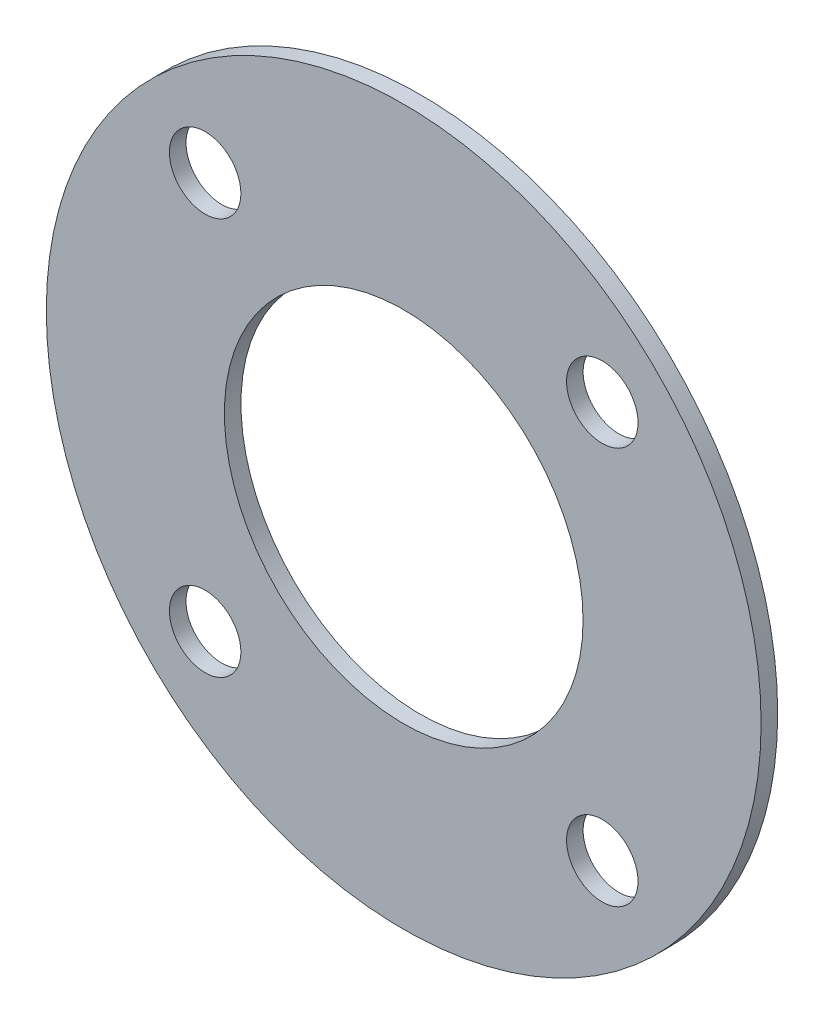
ISO-10303-21;
HEADER;
FILE_DESCRIPTION(('STEP AP214'),'2;1');
FILE_NAME('part.step','',(''),(''),'','','');
FILE_SCHEMA(('AUTOMOTIVE_DESIGN { 1 0 10303 214 1 1 1 1 }'));
ENDSEC;
DATA;
#1=APPLICATION_CONTEXT('core data for automotive mechanical design processes');
#2=APPLICATION_PROTOCOL_DEFINITION('international standard','automotive_design',2000,#1);
#3=PRODUCT_CONTEXT('',#1,'mechanical');
#4=PRODUCT('Part','Part','',(#3));
#5=PRODUCT_RELATED_PRODUCT_CATEGORY('part','',(#4));
#6=PRODUCT_DEFINITION_FORMATION('','',#4);
#7=PRODUCT_DEFINITION_CONTEXT('part definition',#1,'design');
#8=PRODUCT_DEFINITION('design','',#6,#7);
#9=PRODUCT_DEFINITION_SHAPE('','',#8);
#10=(LENGTH_UNIT() NAMED_UNIT(*) SI_UNIT(.MILLI.,.METRE.));
#11=(NAMED_UNIT(*) PLANE_ANGLE_UNIT() SI_UNIT($,.RADIAN.));
#12=(NAMED_UNIT(*) SI_UNIT($,.STERADIAN.) SOLID_ANGLE_UNIT());
#13=UNCERTAINTY_MEASURE_WITH_UNIT(LENGTH_MEASURE(1.E-05),#10,'distance_accuracy_value','');
#14=(GEOMETRIC_REPRESENTATION_CONTEXT(3) GLOBAL_UNCERTAINTY_ASSIGNED_CONTEXT((#13)) GLOBAL_UNIT_ASSIGNED_CONTEXT((#10,
#11,#12)) REPRESENTATION_CONTEXT('',''));
#15=CARTESIAN_POINT('',(0.,0.,0.));
#16=DIRECTION('',(0.,0.,1.));
#17=DIRECTION('',(1.,0.,0.));
#18=AXIS2_PLACEMENT_3D('',#15,#16,#17);
#19=CARTESIAN_POINT('',(0.,0.,3.65));
#20=DIRECTION('',(0.,0.,1.));
#21=DIRECTION('',(1.,0.,0.));
#22=AXIS2_PLACEMENT_3D('',#19,#20,#21);
#23=PLANE('',#22);
#24=CARTESIAN_POINT('',(7.77817459305202,-7.77817459305202,3.65));
#25=DIRECTION('',(0.,0.,1.));
#26=DIRECTION('',(1.,0.,0.));
#27=AXIS2_PLACEMENT_3D('',#24,#25,#26);
#28=CIRCLE('',#27,1.4);
#29=CARTESIAN_POINT('',(9.17817459305202,-7.77817459305202,3.65));
#30=VERTEX_POINT('',#29);
#31=EDGE_CURVE('E64',#30,#30,#28,.T.);
#32=ORIENTED_EDGE('',*,*,#31,.F.);
#33=EDGE_LOOP('',(#32));
#34=FACE_BOUND('',#33,.T.);
#35=CARTESIAN_POINT('',(-7.77817459305202,-7.77817459305202,3.65));
#36=DIRECTION('',(0.,0.,1.));
#37=DIRECTION('',(1.,0.,0.));
#38=AXIS2_PLACEMENT_3D('',#35,#36,#37);
#39=CIRCLE('',#38,1.4);
#40=CARTESIAN_POINT('',(-6.37817459305202,-7.77817459305202,3.65));
#41=VERTEX_POINT('',#40);
#42=EDGE_CURVE('E72',#41,#41,#39,.T.);
#43=ORIENTED_EDGE('',*,*,#42,.F.);
#44=EDGE_LOOP('',(#43));
#45=FACE_BOUND('',#44,.T.);
#46=CARTESIAN_POINT('',(-7.77817459305202,7.77817459305202,3.65));
#47=DIRECTION('',(0.,0.,1.));
#48=DIRECTION('',(1.,0.,0.));
#49=AXIS2_PLACEMENT_3D('',#46,#47,#48);
#50=CIRCLE('',#49,1.4);
#51=CARTESIAN_POINT('',(-6.37817459305202,7.77817459305202,3.65));
#52=VERTEX_POINT('',#51);
#53=EDGE_CURVE('E56',#52,#52,#50,.T.);
#54=ORIENTED_EDGE('',*,*,#53,.F.);
#55=EDGE_LOOP('',(#54));
#56=FACE_BOUND('',#55,.T.);
#57=CARTESIAN_POINT('',(7.77817459305202,7.77817459305202,3.65));
#58=DIRECTION('',(0.,0.,1.));
#59=DIRECTION('',(1.,0.,0.));
#60=AXIS2_PLACEMENT_3D('',#57,#58,#59);
#61=CIRCLE('',#60,1.4);
#62=CARTESIAN_POINT('',(9.17817459305202,7.77817459305202,3.65));
#63=VERTEX_POINT('',#62);
#64=EDGE_CURVE('E57',#63,#63,#61,.T.);
#65=ORIENTED_EDGE('',*,*,#64,.F.);
#66=EDGE_LOOP('',(#65));
#67=FACE_BOUND('',#66,.T.);
#68=CARTESIAN_POINT('',(0.,0.,3.65));
#69=DIRECTION('',(0.,0.,1.));
#70=DIRECTION('',(1.,0.,0.));
#71=AXIS2_PLACEMENT_3D('',#68,#69,#70);
#72=CIRCLE('',#71,14.);
#73=CARTESIAN_POINT('',(14.,0.,3.65));
#74=VERTEX_POINT('',#73);
#75=EDGE_CURVE('E10',#74,#74,#72,.T.);
#76=ORIENTED_EDGE('',*,*,#75,.T.);
#77=EDGE_LOOP('',(#76));
#78=FACE_BOUND('',#77,.T.);
#79=CARTESIAN_POINT('',(0.,0.,3.65));
#80=DIRECTION('',(0.,0.,1.));
#81=DIRECTION('',(1.,0.,0.));
#82=AXIS2_PLACEMENT_3D('',#79,#80,#81);
#83=CIRCLE('',#82,7.025);
#84=CARTESIAN_POINT('',(7.025,0.,3.65));
#85=VERTEX_POINT('',#84);
#86=EDGE_CURVE('E48',#85,#85,#83,.T.);
#87=ORIENTED_EDGE('',*,*,#86,.F.);
#88=EDGE_LOOP('',(#87));
#89=FACE_BOUND('',#88,.T.);
#90=ADVANCED_FACE('F40',(#34,#45,#56,#67,#78,#89),#23,.T.);
#91=CARTESIAN_POINT('',(0.,0.,3.));
#92=DIRECTION('',(0.,0.,1.));
#93=DIRECTION('',(1.,0.,0.));
#94=AXIS2_PLACEMENT_3D('',#91,#92,#93);
#95=PLANE('',#94);
#96=CARTESIAN_POINT('',(7.77817459305202,-7.77817459305202,3.));
#97=DIRECTION('',(0.,0.,1.));
#98=DIRECTION('',(1.,0.,0.));
#99=AXIS2_PLACEMENT_3D('',#96,#97,#98);
#100=CIRCLE('',#99,1.4);
#101=CARTESIAN_POINT('',(9.17817459305202,-7.77817459305202,3.));
#102=VERTEX_POINT('',#101);
#103=EDGE_CURVE('E65',#102,#102,#100,.T.);
#104=ORIENTED_EDGE('',*,*,#103,.T.);
#105=EDGE_LOOP('',(#104));
#106=FACE_BOUND('',#105,.T.);
#107=CARTESIAN_POINT('',(-7.77817459305202,-7.77817459305202,3.));
#108=DIRECTION('',(0.,0.,1.));
#109=DIRECTION('',(1.,0.,0.));
#110=AXIS2_PLACEMENT_3D('',#107,#108,#109);
#111=CIRCLE('',#110,1.4);
#112=CARTESIAN_POINT('',(-6.37817459305202,-7.77817459305202,3.));
#113=VERTEX_POINT('',#112);
#114=EDGE_CURVE('E69',#113,#113,#111,.T.);
#115=ORIENTED_EDGE('',*,*,#114,.T.);
#116=EDGE_LOOP('',(#115));
#117=FACE_BOUND('',#116,.T.);
#118=CARTESIAN_POINT('',(-7.77817459305202,7.77817459305202,3.));
#119=DIRECTION('',(0.,0.,1.));
#120=DIRECTION('',(1.,0.,0.));
#121=AXIS2_PLACEMENT_3D('',#118,#119,#120);
#122=CIRCLE('',#121,1.4);
#123=CARTESIAN_POINT('',(-6.37817459305202,7.77817459305202,3.));
#124=VERTEX_POINT('',#123);
#125=EDGE_CURVE('E74',#124,#124,#122,.T.);
#126=ORIENTED_EDGE('',*,*,#125,.T.);
#127=EDGE_LOOP('',(#126));
#128=FACE_BOUND('',#127,.T.);
#129=CARTESIAN_POINT('',(7.77817459305202,7.77817459305202,3.));
#130=DIRECTION('',(0.,0.,1.));
#131=DIRECTION('',(1.,0.,0.));
#132=AXIS2_PLACEMENT_3D('',#129,#130,#131);
#133=CIRCLE('',#132,1.4);
#134=CARTESIAN_POINT('',(9.17817459305202,7.77817459305202,3.));
#135=VERTEX_POINT('',#134);
#136=EDGE_CURVE('E52',#135,#135,#133,.T.);
#137=ORIENTED_EDGE('',*,*,#136,.T.);
#138=EDGE_LOOP('',(#137));
#139=FACE_BOUND('',#138,.T.);
#140=CARTESIAN_POINT('',(0.,0.,3.));
#141=DIRECTION('',(0.,0.,1.));
#142=DIRECTION('',(1.,0.,0.));
#143=AXIS2_PLACEMENT_3D('',#140,#141,#142);
#144=CIRCLE('',#143,14.);
#145=CARTESIAN_POINT('',(14.,0.,3.));
#146=VERTEX_POINT('',#145);
#147=EDGE_CURVE('E41',#146,#146,#144,.T.);
#148=ORIENTED_EDGE('',*,*,#147,.F.);
#149=EDGE_LOOP('',(#148));
#150=FACE_BOUND('',#149,.T.);
#151=CARTESIAN_POINT('',(0.,0.,3.));
#152=DIRECTION('',(0.,0.,1.));
#153=DIRECTION('',(1.,0.,0.));
#154=AXIS2_PLACEMENT_3D('',#151,#152,#153);
#155=CIRCLE('',#154,7.025);
#156=CARTESIAN_POINT('',(7.025,0.,3.));
#157=VERTEX_POINT('',#156);
#158=EDGE_CURVE('E49',#157,#157,#155,.T.);
#159=ORIENTED_EDGE('',*,*,#158,.T.);
#160=EDGE_LOOP('',(#159));
#161=FACE_BOUND('',#160,.T.);
#162=ADVANCED_FACE('F81',(#106,#117,#128,#139,#150,#161),#95,.F.);
#163=CARTESIAN_POINT('',(0.,0.,3.65));
#164=DIRECTION('',(0.,0.,-1.));
#165=DIRECTION('',(-1.,0.,0.));
#166=AXIS2_PLACEMENT_3D('',#163,#164,#165);
#167=CYLINDRICAL_SURFACE('',#166,14.);
#168=ORIENTED_EDGE('',*,*,#75,.F.);
#169=EDGE_LOOP('',(#168));
#170=FACE_BOUND('',#169,.T.);
#171=ORIENTED_EDGE('',*,*,#147,.T.);
#172=EDGE_LOOP('',(#171));
#173=FACE_BOUND('',#172,.T.);
#174=ADVANCED_FACE('F39',(#170,#173),#167,.T.);
#175=CARTESIAN_POINT('',(0.,0.,3.65));
#176=DIRECTION('',(0.,0.,-1.));
#177=DIRECTION('',(-1.,0.,0.));
#178=AXIS2_PLACEMENT_3D('',#175,#176,#177);
#179=CYLINDRICAL_SURFACE('',#178,7.025);
#180=ORIENTED_EDGE('',*,*,#86,.T.);
#181=EDGE_LOOP('',(#180));
#182=FACE_BOUND('',#181,.T.);
#183=ORIENTED_EDGE('',*,*,#158,.F.);
#184=EDGE_LOOP('',(#183));
#185=FACE_BOUND('',#184,.T.);
#186=ADVANCED_FACE('F93',(#182,#185),#179,.F.);
#187=CARTESIAN_POINT('',(7.77817459305202,7.77817459305202,3.));
#188=DIRECTION('',(0.,0.,1.));
#189=DIRECTION('',(1.,0.,0.));
#190=AXIS2_PLACEMENT_3D('',#187,#188,#189);
#191=CYLINDRICAL_SURFACE('',#190,1.4);
#192=ORIENTED_EDGE('',*,*,#136,.F.);
#193=EDGE_LOOP('',(#192));
#194=FACE_BOUND('',#193,.T.);
#195=ORIENTED_EDGE('',*,*,#64,.T.);
#196=EDGE_LOOP('',(#195));
#197=FACE_BOUND('',#196,.T.);
#198=ADVANCED_FACE('F94',(#194,#197),#191,.F.);
#199=CARTESIAN_POINT('',(-7.77817459305202,7.77817459305202,3.));
#200=DIRECTION('',(0.,0.,1.));
#201=DIRECTION('',(1.,0.,0.));
#202=AXIS2_PLACEMENT_3D('',#199,#200,#201);
#203=CYLINDRICAL_SURFACE('',#202,1.4);
#204=ORIENTED_EDGE('',*,*,#125,.F.);
#205=EDGE_LOOP('',(#204));
#206=FACE_BOUND('',#205,.T.);
#207=ORIENTED_EDGE('',*,*,#53,.T.);
#208=EDGE_LOOP('',(#207));
#209=FACE_BOUND('',#208,.T.);
#210=ADVANCED_FACE('F79',(#206,#209),#203,.F.);
#211=CARTESIAN_POINT('',(-7.77817459305202,-7.77817459305202,3.));
#212=DIRECTION('',(0.,0.,1.));
#213=DIRECTION('',(1.,0.,0.));
#214=AXIS2_PLACEMENT_3D('',#211,#212,#213);
#215=CYLINDRICAL_SURFACE('',#214,1.4);
#216=ORIENTED_EDGE('',*,*,#114,.F.);
#217=EDGE_LOOP('',(#216));
#218=FACE_BOUND('',#217,.T.);
#219=ORIENTED_EDGE('',*,*,#42,.T.);
#220=EDGE_LOOP('',(#219));
#221=FACE_BOUND('',#220,.T.);
#222=ADVANCED_FACE('F115',(#218,#221),#215,.F.);
#223=CARTESIAN_POINT('',(7.77817459305202,-7.77817459305202,3.));
#224=DIRECTION('',(0.,0.,1.));
#225=DIRECTION('',(1.,0.,0.));
#226=AXIS2_PLACEMENT_3D('',#223,#224,#225);
#227=CYLINDRICAL_SURFACE('',#226,1.4);
#228=ORIENTED_EDGE('',*,*,#103,.F.);
#229=EDGE_LOOP('',(#228));
#230=FACE_BOUND('',#229,.T.);
#231=ORIENTED_EDGE('',*,*,#31,.T.);
#232=EDGE_LOOP('',(#231));
#233=FACE_BOUND('',#232,.T.);
#234=ADVANCED_FACE('F108',(#230,#233),#227,.F.);
#235=CLOSED_SHELL('',(#90,#162,#174,#186,#198,#210,#222,#234));
#236=MANIFOLD_SOLID_BREP('B2',#235);
#237=ADVANCED_BREP_SHAPE_REPRESENTATION('',(#18,#236),#14);
#238=SHAPE_DEFINITION_REPRESENTATION(#9,#237);
ENDSEC;
END-ISO-10303-21;
